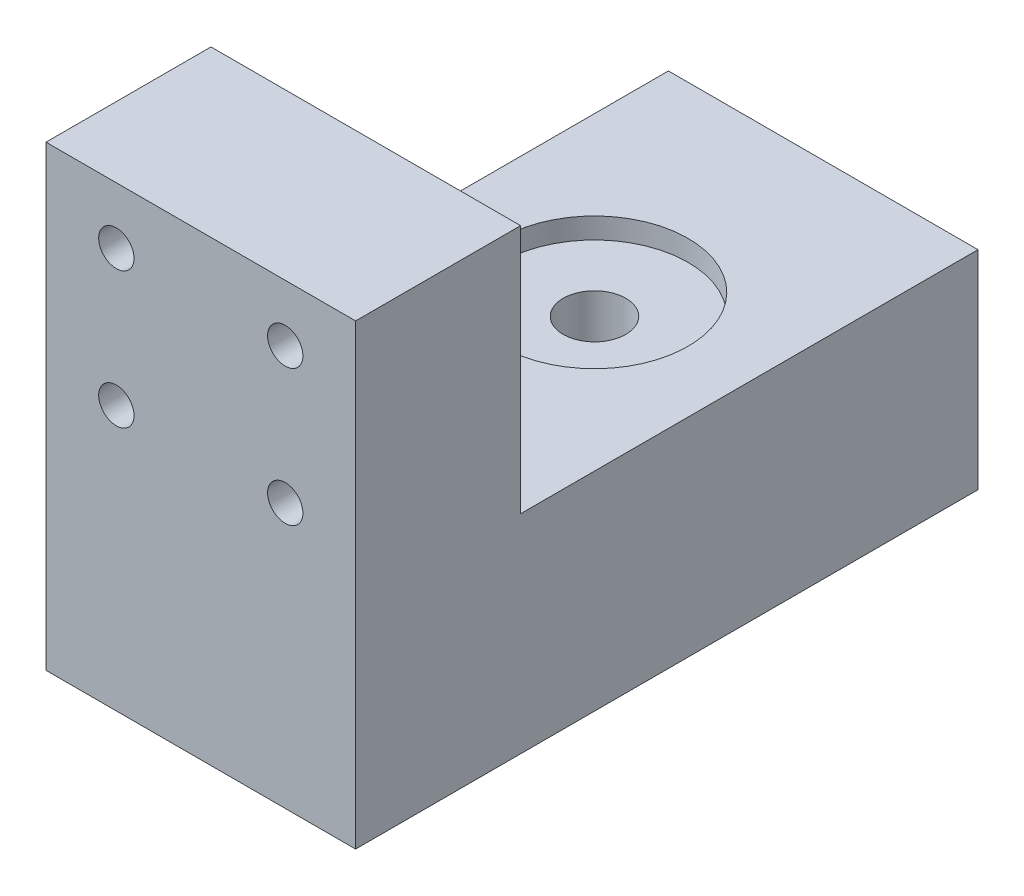
ISO-10303-21;
HEADER;
FILE_DESCRIPTION(('STEP AP214'),'2;1');
FILE_NAME('part.step','',(''),(''),'','','');
FILE_SCHEMA(('AUTOMOTIVE_DESIGN { 1 0 10303 214 1 1 1 1 }'));
ENDSEC;
DATA;
#1=APPLICATION_CONTEXT('core data for automotive mechanical design processes');
#2=APPLICATION_PROTOCOL_DEFINITION('international standard','automotive_design',2000,#1);
#3=PRODUCT_CONTEXT('',#1,'mechanical');
#4=PRODUCT('Part','Part','',(#3));
#5=PRODUCT_RELATED_PRODUCT_CATEGORY('part','',(#4));
#6=PRODUCT_DEFINITION_FORMATION('','',#4);
#7=PRODUCT_DEFINITION_CONTEXT('part definition',#1,'design');
#8=PRODUCT_DEFINITION('design','',#6,#7);
#9=PRODUCT_DEFINITION_SHAPE('','',#8);
#10=(LENGTH_UNIT() NAMED_UNIT(*) SI_UNIT(.MILLI.,.METRE.));
#11=(NAMED_UNIT(*) PLANE_ANGLE_UNIT() SI_UNIT($,.RADIAN.));
#12=(NAMED_UNIT(*) SI_UNIT($,.STERADIAN.) SOLID_ANGLE_UNIT());
#13=UNCERTAINTY_MEASURE_WITH_UNIT(LENGTH_MEASURE(1.E-05),#10,'distance_accuracy_value','');
#14=(GEOMETRIC_REPRESENTATION_CONTEXT(3) GLOBAL_UNCERTAINTY_ASSIGNED_CONTEXT((#13)) GLOBAL_UNIT_ASSIGNED_CONTEXT((#10,
#11,#12)) REPRESENTATION_CONTEXT('',''));
#15=CARTESIAN_POINT('',(0.,0.,0.));
#16=DIRECTION('',(0.,0.,1.));
#17=DIRECTION('',(1.,0.,0.));
#18=AXIS2_PLACEMENT_3D('',#15,#16,#17);
#19=CARTESIAN_POINT('',(14.89,-10.,44.));
#20=DIRECTION('',(-1.,0.,0.));
#21=DIRECTION('',(0.,-1.,0.));
#22=AXIS2_PLACEMENT_3D('',#19,#20,#21);
#23=PLANE('',#22);
#24=DIRECTION('',(0.,1.,0.));
#25=VECTOR('',#24,1.);
#26=CARTESIAN_POINT('',(14.89,-10.,0.));
#27=LINE('',#26,#25);
#28=CARTESIAN_POINT('',(14.89,-10.,0.));
#29=VERTEX_POINT('',#28);
#30=CARTESIAN_POINT('',(14.89,10.,0.));
#31=VERTEX_POINT('',#30);
#32=EDGE_CURVE('E98',#29,#31,#27,.T.);
#33=ORIENTED_EDGE('',*,*,#32,.T.);
#34=DIRECTION('',(0.,0.,-1.));
#35=VECTOR('',#34,1.);
#36=CARTESIAN_POINT('',(14.89,10.,44.));
#37=LINE('',#36,#35);
#38=CARTESIAN_POINT('',(14.89,10.,44.));
#39=VERTEX_POINT('',#38);
#40=EDGE_CURVE('E11',#39,#31,#37,.T.);
#41=ORIENTED_EDGE('',*,*,#40,.F.);
#42=DIRECTION('',(0.,1.,0.));
#43=VECTOR('',#42,1.);
#44=CARTESIAN_POINT('',(14.89,-10.,44.));
#45=LINE('',#44,#43);
#46=CARTESIAN_POINT('',(14.89,34.,44.));
#47=VERTEX_POINT('',#46);
#48=EDGE_CURVE('E133',#39,#47,#45,.T.);
#49=ORIENTED_EDGE('',*,*,#48,.T.);
#50=DIRECTION('',(0.,0.,-1.));
#51=VECTOR('',#50,1.);
#52=CARTESIAN_POINT('',(14.89,34.,59.87));
#53=LINE('',#52,#51);
#54=CARTESIAN_POINT('',(14.89,34.,59.87));
#55=VERTEX_POINT('',#54);
#56=EDGE_CURVE('E116',#55,#47,#53,.T.);
#57=ORIENTED_EDGE('',*,*,#56,.F.);
#58=DIRECTION('',(0.,1.,0.));
#59=VECTOR('',#58,1.);
#60=CARTESIAN_POINT('',(14.89,-10.,59.87));
#61=LINE('',#60,#59);
#62=CARTESIAN_POINT('',(14.89,-10.,59.87));
#63=VERTEX_POINT('',#62);
#64=EDGE_CURVE('E107',#63,#55,#61,.T.);
#65=ORIENTED_EDGE('',*,*,#64,.F.);
#66=DIRECTION('',(0.,0.,-1.));
#67=VECTOR('',#66,1.);
#68=CARTESIAN_POINT('',(14.89,-10.,44.));
#69=LINE('',#68,#67);
#70=EDGE_CURVE('E82',#63,#29,#69,.T.);
#71=ORIENTED_EDGE('',*,*,#70,.T.);
#72=EDGE_LOOP('',(#33,#41,#49,#57,#65,#71));
#73=FACE_BOUND('',#72,.T.);
#74=ADVANCED_FACE('F41',(#73),#23,.F.);
#75=CARTESIAN_POINT('',(14.89,10.,44.));
#76=DIRECTION('',(0.,-1.,0.));
#77=DIRECTION('',(1.,0.,0.));
#78=AXIS2_PLACEMENT_3D('',#75,#76,#77);
#79=PLANE('',#78);
#80=CARTESIAN_POINT('',(0.,10.,22.));
#81=DIRECTION('',(0.,1.,0.));
#82=DIRECTION('',(-1.,0.,0.));
#83=AXIS2_PLACEMENT_3D('',#80,#81,#82);
#84=CIRCLE('',#83,9.);
#85=CARTESIAN_POINT('',(-9.,10.,22.));
#86=VERTEX_POINT('',#85);
#87=EDGE_CURVE('E152',#86,#86,#84,.T.);
#88=ORIENTED_EDGE('',*,*,#87,.F.);
#89=EDGE_LOOP('',(#88));
#90=FACE_BOUND('',#89,.T.);
#91=DIRECTION('',(-1.,0.,0.));
#92=VECTOR('',#91,1.);
#93=CARTESIAN_POINT('',(14.89,10.,0.));
#94=LINE('',#93,#92);
#95=CARTESIAN_POINT('',(-14.89,10.,0.));
#96=VERTEX_POINT('',#95);
#97=EDGE_CURVE('E91',#31,#96,#94,.T.);
#98=ORIENTED_EDGE('',*,*,#97,.T.);
#99=DIRECTION('',(0.,0.,-1.));
#100=VECTOR('',#99,1.);
#101=CARTESIAN_POINT('',(-14.89,10.,44.));
#102=LINE('',#101,#100);
#103=CARTESIAN_POINT('',(-14.89,10.,44.));
#104=VERTEX_POINT('',#103);
#105=EDGE_CURVE('E47',#104,#96,#102,.T.);
#106=ORIENTED_EDGE('',*,*,#105,.F.);
#107=DIRECTION('',(-1.,0.,0.));
#108=VECTOR('',#107,1.);
#109=CARTESIAN_POINT('',(14.89,10.,44.));
#110=LINE('',#109,#108);
#111=EDGE_CURVE('E54',#39,#104,#110,.T.);
#112=ORIENTED_EDGE('',*,*,#111,.F.);
#113=ORIENTED_EDGE('',*,*,#40,.T.);
#114=EDGE_LOOP('',(#98,#106,#112,#113));
#115=FACE_BOUND('',#114,.T.);
#116=ADVANCED_FACE('F138',(#90,#115),#79,.F.);
#117=CARTESIAN_POINT('',(-14.89,-10.,44.));
#118=DIRECTION('',(-1.,0.,0.));
#119=DIRECTION('',(0.,0.,1.));
#120=AXIS2_PLACEMENT_3D('',#117,#118,#119);
#121=PLANE('',#120);
#122=DIRECTION('',(0.,1.,0.));
#123=VECTOR('',#122,1.);
#124=CARTESIAN_POINT('',(-14.89,-10.,0.));
#125=LINE('',#124,#123);
#126=CARTESIAN_POINT('',(-14.89,-10.,0.));
#127=VERTEX_POINT('',#126);
#128=EDGE_CURVE('E86',#127,#96,#125,.T.);
#129=ORIENTED_EDGE('',*,*,#128,.F.);
#130=DIRECTION('',(0.,0.,-1.));
#131=VECTOR('',#130,1.);
#132=CARTESIAN_POINT('',(-14.89,-10.,44.));
#133=LINE('',#132,#131);
#134=CARTESIAN_POINT('',(-14.89,-10.,59.87));
#135=VERTEX_POINT('',#134);
#136=EDGE_CURVE('E71',#135,#127,#133,.T.);
#137=ORIENTED_EDGE('',*,*,#136,.F.);
#138=DIRECTION('',(0.,1.,0.));
#139=VECTOR('',#138,1.);
#140=CARTESIAN_POINT('',(-14.89,-10.,59.87));
#141=LINE('',#140,#139);
#142=CARTESIAN_POINT('',(-14.89,34.,59.87));
#143=VERTEX_POINT('',#142);
#144=EDGE_CURVE('E111',#135,#143,#141,.T.);
#145=ORIENTED_EDGE('',*,*,#144,.T.);
#146=DIRECTION('',(0.,0.,-1.));
#147=VECTOR('',#146,1.);
#148=CARTESIAN_POINT('',(-14.89,34.,59.87));
#149=LINE('',#148,#147);
#150=CARTESIAN_POINT('',(-14.89,34.,44.));
#151=VERTEX_POINT('',#150);
#152=EDGE_CURVE('E113',#143,#151,#149,.T.);
#153=ORIENTED_EDGE('',*,*,#152,.T.);
#154=DIRECTION('',(0.,1.,0.));
#155=VECTOR('',#154,1.);
#156=CARTESIAN_POINT('',(-14.89,-10.,44.));
#157=LINE('',#156,#155);
#158=EDGE_CURVE('E124',#104,#151,#157,.T.);
#159=ORIENTED_EDGE('',*,*,#158,.F.);
#160=ORIENTED_EDGE('',*,*,#105,.T.);
#161=EDGE_LOOP('',(#129,#137,#145,#153,#159,#160));
#162=FACE_BOUND('',#161,.T.);
#163=ADVANCED_FACE('F90',(#162),#121,.T.);
#164=CARTESIAN_POINT('',(14.89,-10.,44.));
#165=DIRECTION('',(0.,-1.,0.));
#166=DIRECTION('',(1.,0.,0.));
#167=AXIS2_PLACEMENT_3D('',#164,#165,#166);
#168=PLANE('',#167);
#169=CARTESIAN_POINT('',(0.,-10.,22.));
#170=DIRECTION('',(0.,1.,0.));
#171=DIRECTION('',(-1.,0.,0.));
#172=AXIS2_PLACEMENT_3D('',#169,#170,#171);
#173=CIRCLE('',#172,3.0125);
#174=CARTESIAN_POINT('',(-3.0125,-10.,22.));
#175=VERTEX_POINT('',#174);
#176=EDGE_CURVE('E160',#175,#175,#173,.T.);
#177=ORIENTED_EDGE('',*,*,#176,.T.);
#178=EDGE_LOOP('',(#177));
#179=FACE_BOUND('',#178,.T.);
#180=DIRECTION('',(-1.,0.,0.));
#181=VECTOR('',#180,1.);
#182=CARTESIAN_POINT('',(14.89,-10.,0.));
#183=LINE('',#182,#181);
#184=EDGE_CURVE('E76',#29,#127,#183,.T.);
#185=ORIENTED_EDGE('',*,*,#184,.F.);
#186=ORIENTED_EDGE('',*,*,#70,.F.);
#187=DIRECTION('',(1.,0.,0.));
#188=VECTOR('',#187,1.);
#189=CARTESIAN_POINT('',(-14.89,-10.,59.87));
#190=LINE('',#189,#188);
#191=EDGE_CURVE('E83',#135,#63,#190,.T.);
#192=ORIENTED_EDGE('',*,*,#191,.F.);
#193=ORIENTED_EDGE('',*,*,#136,.T.);
#194=EDGE_LOOP('',(#185,#186,#192,#193));
#195=FACE_BOUND('',#194,.T.);
#196=ADVANCED_FACE('F73',(#179,#195),#168,.T.);
#197=CARTESIAN_POINT('',(0.,0.,0.));
#198=DIRECTION('',(0.,0.,1.));
#199=DIRECTION('',(1.,0.,0.));
#200=AXIS2_PLACEMENT_3D('',#197,#198,#199);
#201=PLANE('',#200);
#202=ORIENTED_EDGE('',*,*,#32,.F.);
#203=ORIENTED_EDGE('',*,*,#184,.T.);
#204=ORIENTED_EDGE('',*,*,#128,.T.);
#205=ORIENTED_EDGE('',*,*,#97,.F.);
#206=EDGE_LOOP('',(#202,#203,#204,#205));
#207=FACE_BOUND('',#206,.T.);
#208=ADVANCED_FACE('F96',(#207),#201,.F.);
#209=CARTESIAN_POINT('',(-14.89,34.,59.87));
#210=DIRECTION('',(0.,1.,0.));
#211=DIRECTION('',(0.,0.,1.));
#212=AXIS2_PLACEMENT_3D('',#209,#210,#211);
#213=PLANE('',#212);
#214=DIRECTION('',(1.,0.,0.));
#215=VECTOR('',#214,1.);
#216=CARTESIAN_POINT('',(-14.89,34.,44.));
#217=LINE('',#216,#215);
#218=EDGE_CURVE('E130',#151,#47,#217,.T.);
#219=ORIENTED_EDGE('',*,*,#218,.F.);
#220=ORIENTED_EDGE('',*,*,#152,.F.);
#221=DIRECTION('',(1.,0.,0.));
#222=VECTOR('',#221,1.);
#223=CARTESIAN_POINT('',(-14.89,34.,59.87));
#224=LINE('',#223,#222);
#225=EDGE_CURVE('E117',#143,#55,#224,.T.);
#226=ORIENTED_EDGE('',*,*,#225,.T.);
#227=ORIENTED_EDGE('',*,*,#56,.T.);
#228=EDGE_LOOP('',(#219,#220,#226,#227));
#229=FACE_BOUND('',#228,.T.);
#230=ADVANCED_FACE('F148',(#229),#213,.T.);
#231=CARTESIAN_POINT('',(0.,0.,59.87));
#232=DIRECTION('',(0.,0.,-1.));
#233=DIRECTION('',(-1.,0.,0.));
#234=AXIS2_PLACEMENT_3D('',#231,#232,#233);
#235=PLANE('',#234);
#236=CARTESIAN_POINT('',(-8.12371382112812,28.5469822601436,59.87));
#237=DIRECTION('',(0.,0.,-1.));
#238=DIRECTION('',(-1.,0.,0.));
#239=AXIS2_PLACEMENT_3D('',#236,#237,#238);
#240=CIRCLE('',#239,1.7);
#241=CARTESIAN_POINT('',(-9.82371382112813,28.5469822601436,59.87));
#242=VERTEX_POINT('',#241);
#243=EDGE_CURVE('E175',#242,#242,#240,.T.);
#244=ORIENTED_EDGE('',*,*,#243,.T.);
#245=EDGE_LOOP('',(#244));
#246=FACE_BOUND('',#245,.T.);
#247=CARTESIAN_POINT('',(-8.12371382112812,15.4530177398565,59.87));
#248=DIRECTION('',(0.,0.,-1.));
#249=DIRECTION('',(-1.,0.,0.));
#250=AXIS2_PLACEMENT_3D('',#247,#248,#249);
#251=CIRCLE('',#250,1.7);
#252=CARTESIAN_POINT('',(-9.82371382112812,15.4530177398565,59.87));
#253=VERTEX_POINT('',#252);
#254=EDGE_CURVE('E176',#253,#253,#251,.T.);
#255=ORIENTED_EDGE('',*,*,#254,.T.);
#256=EDGE_LOOP('',(#255));
#257=FACE_BOUND('',#256,.T.);
#258=CARTESIAN_POINT('',(8.12371382112813,15.4530177398565,59.87));
#259=DIRECTION('',(0.,0.,-1.));
#260=DIRECTION('',(-1.,0.,0.));
#261=AXIS2_PLACEMENT_3D('',#258,#259,#260);
#262=CIRCLE('',#261,1.7);
#263=CARTESIAN_POINT('',(6.42371382112813,15.4530177398565,59.87));
#264=VERTEX_POINT('',#263);
#265=EDGE_CURVE('E184',#264,#264,#262,.T.);
#266=ORIENTED_EDGE('',*,*,#265,.T.);
#267=EDGE_LOOP('',(#266));
#268=FACE_BOUND('',#267,.T.);
#269=CARTESIAN_POINT('',(8.12371382112813,28.5469822601436,59.87));
#270=DIRECTION('',(0.,0.,-1.));
#271=DIRECTION('',(-1.,0.,0.));
#272=AXIS2_PLACEMENT_3D('',#269,#270,#271);
#273=CIRCLE('',#272,1.7);
#274=CARTESIAN_POINT('',(6.42371382112813,28.5469822601436,59.87));
#275=VERTEX_POINT('',#274);
#276=EDGE_CURVE('E162',#275,#275,#273,.T.);
#277=ORIENTED_EDGE('',*,*,#276,.T.);
#278=EDGE_LOOP('',(#277));
#279=FACE_BOUND('',#278,.T.);
#280=ORIENTED_EDGE('',*,*,#144,.F.);
#281=ORIENTED_EDGE('',*,*,#191,.T.);
#282=ORIENTED_EDGE('',*,*,#64,.T.);
#283=ORIENTED_EDGE('',*,*,#225,.F.);
#284=EDGE_LOOP('',(#280,#281,#282,#283));
#285=FACE_BOUND('',#284,.T.);
#286=ADVANCED_FACE('F115',(#246,#257,#268,#279,#285),#235,.F.);
#287=CARTESIAN_POINT('',(0.,0.,44.));
#288=DIRECTION('',(0.,0.,-1.));
#289=DIRECTION('',(-1.,0.,0.));
#290=AXIS2_PLACEMENT_3D('',#287,#288,#289);
#291=PLANE('',#290);
#292=CARTESIAN_POINT('',(-8.12371382112812,28.5469822601436,44.));
#293=DIRECTION('',(0.,0.,-1.));
#294=DIRECTION('',(-1.,0.,0.));
#295=AXIS2_PLACEMENT_3D('',#292,#293,#294);
#296=CIRCLE('',#295,1.7);
#297=CARTESIAN_POINT('',(-9.82371382112813,28.5469822601436,44.));
#298=VERTEX_POINT('',#297);
#299=EDGE_CURVE('E172',#298,#298,#296,.T.);
#300=ORIENTED_EDGE('',*,*,#299,.F.);
#301=EDGE_LOOP('',(#300));
#302=FACE_BOUND('',#301,.T.);
#303=CARTESIAN_POINT('',(-8.12371382112812,15.4530177398565,44.));
#304=DIRECTION('',(0.,0.,-1.));
#305=DIRECTION('',(-1.,0.,0.));
#306=AXIS2_PLACEMENT_3D('',#303,#304,#305);
#307=CIRCLE('',#306,1.7);
#308=CARTESIAN_POINT('',(-9.82371382112812,15.4530177398565,44.));
#309=VERTEX_POINT('',#308);
#310=EDGE_CURVE('E182',#309,#309,#307,.T.);
#311=ORIENTED_EDGE('',*,*,#310,.F.);
#312=EDGE_LOOP('',(#311));
#313=FACE_BOUND('',#312,.T.);
#314=CARTESIAN_POINT('',(8.12371382112813,15.4530177398565,44.));
#315=DIRECTION('',(0.,0.,-1.));
#316=DIRECTION('',(-1.,0.,0.));
#317=AXIS2_PLACEMENT_3D('',#314,#315,#316);
#318=CIRCLE('',#317,1.7);
#319=CARTESIAN_POINT('',(6.42371382112813,15.4530177398565,44.));
#320=VERTEX_POINT('',#319);
#321=EDGE_CURVE('E166',#320,#320,#318,.T.);
#322=ORIENTED_EDGE('',*,*,#321,.F.);
#323=EDGE_LOOP('',(#322));
#324=FACE_BOUND('',#323,.T.);
#325=CARTESIAN_POINT('',(8.12371382112813,28.5469822601436,44.));
#326=DIRECTION('',(0.,0.,-1.));
#327=DIRECTION('',(-1.,0.,0.));
#328=AXIS2_PLACEMENT_3D('',#325,#326,#327);
#329=CIRCLE('',#328,1.7);
#330=CARTESIAN_POINT('',(6.42371382112813,28.5469822601436,44.));
#331=VERTEX_POINT('',#330);
#332=EDGE_CURVE('E167',#331,#331,#329,.T.);
#333=ORIENTED_EDGE('',*,*,#332,.F.);
#334=EDGE_LOOP('',(#333));
#335=FACE_BOUND('',#334,.T.);
#336=ORIENTED_EDGE('',*,*,#48,.F.);
#337=ORIENTED_EDGE('',*,*,#111,.T.);
#338=ORIENTED_EDGE('',*,*,#158,.T.);
#339=ORIENTED_EDGE('',*,*,#218,.T.);
#340=EDGE_LOOP('',(#336,#337,#338,#339));
#341=FACE_BOUND('',#340,.T.);
#342=ADVANCED_FACE('F137',(#302,#313,#324,#335,#341),#291,.T.);
#343=CARTESIAN_POINT('',(0.,8.,22.));
#344=DIRECTION('',(0.,1.,0.));
#345=DIRECTION('',(-1.,0.,0.));
#346=AXIS2_PLACEMENT_3D('',#343,#344,#345);
#347=CYLINDRICAL_SURFACE('',#346,9.);
#348=CARTESIAN_POINT('',(0.,8.,22.));
#349=DIRECTION('',(0.,1.,0.));
#350=DIRECTION('',(-1.,0.,0.));
#351=AXIS2_PLACEMENT_3D('',#348,#349,#350);
#352=CIRCLE('',#351,9.);
#353=CARTESIAN_POINT('',(-9.,8.,22.));
#354=VERTEX_POINT('',#353);
#355=EDGE_CURVE('E126',#354,#354,#352,.T.);
#356=ORIENTED_EDGE('',*,*,#355,.F.);
#357=EDGE_LOOP('',(#356));
#358=FACE_BOUND('',#357,.T.);
#359=ORIENTED_EDGE('',*,*,#87,.T.);
#360=EDGE_LOOP('',(#359));
#361=FACE_BOUND('',#360,.T.);
#362=ADVANCED_FACE('F194',(#358,#361),#347,.F.);
#363=CARTESIAN_POINT('',(0.,8.,22.));
#364=DIRECTION('',(0.,1.,0.));
#365=DIRECTION('',(-1.,0.,0.));
#366=AXIS2_PLACEMENT_3D('',#363,#364,#365);
#367=PLANE('',#366);
#368=CARTESIAN_POINT('',(0.,8.,22.));
#369=DIRECTION('',(0.,1.,0.));
#370=DIRECTION('',(-1.,0.,0.));
#371=AXIS2_PLACEMENT_3D('',#368,#369,#370);
#372=CIRCLE('',#371,3.0125);
#373=CARTESIAN_POINT('',(-3.0125,8.,22.));
#374=VERTEX_POINT('',#373);
#375=EDGE_CURVE('E159',#374,#374,#372,.T.);
#376=ORIENTED_EDGE('',*,*,#375,.F.);
#377=EDGE_LOOP('',(#376));
#378=FACE_BOUND('',#377,.T.);
#379=ORIENTED_EDGE('',*,*,#355,.T.);
#380=EDGE_LOOP('',(#379));
#381=FACE_BOUND('',#380,.T.);
#382=ADVANCED_FACE('F211',(#378,#381),#367,.T.);
#383=CARTESIAN_POINT('',(0.,-10.,22.));
#384=DIRECTION('',(0.,1.,0.));
#385=DIRECTION('',(-1.,0.,0.));
#386=AXIS2_PLACEMENT_3D('',#383,#384,#385);
#387=CYLINDRICAL_SURFACE('',#386,3.0125);
#388=ORIENTED_EDGE('',*,*,#176,.F.);
#389=EDGE_LOOP('',(#388));
#390=FACE_BOUND('',#389,.T.);
#391=ORIENTED_EDGE('',*,*,#375,.T.);
#392=EDGE_LOOP('',(#391));
#393=FACE_BOUND('',#392,.T.);
#394=ADVANCED_FACE('F203',(#390,#393),#387,.F.);
#395=CARTESIAN_POINT('',(8.12371382112813,28.5469822601436,59.87));
#396=DIRECTION('',(0.,0.,-1.));
#397=DIRECTION('',(-1.,0.,0.));
#398=AXIS2_PLACEMENT_3D('',#395,#396,#397);
#399=CYLINDRICAL_SURFACE('',#398,1.7);
#400=ORIENTED_EDGE('',*,*,#276,.F.);
#401=EDGE_LOOP('',(#400));
#402=FACE_BOUND('',#401,.T.);
#403=ORIENTED_EDGE('',*,*,#332,.T.);
#404=EDGE_LOOP('',(#403));
#405=FACE_BOUND('',#404,.T.);
#406=ADVANCED_FACE('F200',(#402,#405),#399,.F.);
#407=CARTESIAN_POINT('',(8.12371382112813,15.4530177398565,59.87));
#408=DIRECTION('',(0.,0.,-1.));
#409=DIRECTION('',(-1.,0.,0.));
#410=AXIS2_PLACEMENT_3D('',#407,#408,#409);
#411=CYLINDRICAL_SURFACE('',#410,1.7);
#412=ORIENTED_EDGE('',*,*,#265,.F.);
#413=EDGE_LOOP('',(#412));
#414=FACE_BOUND('',#413,.T.);
#415=ORIENTED_EDGE('',*,*,#321,.T.);
#416=EDGE_LOOP('',(#415));
#417=FACE_BOUND('',#416,.T.);
#418=ADVANCED_FACE('F187',(#414,#417),#411,.F.);
#419=CARTESIAN_POINT('',(-8.12371382112812,15.4530177398565,59.87));
#420=DIRECTION('',(0.,0.,-1.));
#421=DIRECTION('',(-1.,0.,0.));
#422=AXIS2_PLACEMENT_3D('',#419,#420,#421);
#423=CYLINDRICAL_SURFACE('',#422,1.7);
#424=ORIENTED_EDGE('',*,*,#254,.F.);
#425=EDGE_LOOP('',(#424));
#426=FACE_BOUND('',#425,.T.);
#427=ORIENTED_EDGE('',*,*,#310,.T.);
#428=EDGE_LOOP('',(#427));
#429=FACE_BOUND('',#428,.T.);
#430=ADVANCED_FACE('F210',(#426,#429),#423,.F.);
#431=CARTESIAN_POINT('',(-8.12371382112812,28.5469822601436,59.87));
#432=DIRECTION('',(0.,0.,-1.));
#433=DIRECTION('',(-1.,0.,0.));
#434=AXIS2_PLACEMENT_3D('',#431,#432,#433);
#435=CYLINDRICAL_SURFACE('',#434,1.7);
#436=ORIENTED_EDGE('',*,*,#243,.F.);
#437=EDGE_LOOP('',(#436));
#438=FACE_BOUND('',#437,.T.);
#439=ORIENTED_EDGE('',*,*,#299,.T.);
#440=EDGE_LOOP('',(#439));
#441=FACE_BOUND('',#440,.T.);
#442=ADVANCED_FACE('F291',(#438,#441),#435,.F.);
#443=CLOSED_SHELL('',(#74,#116,#163,#196,#208,#230,#286,#342,#362,#382,#394,#406,#418,#430,#442));
#444=MANIFOLD_SOLID_BREP('B2',#443);
#445=ADVANCED_BREP_SHAPE_REPRESENTATION('',(#18,#444),#14);
#446=SHAPE_DEFINITION_REPRESENTATION(#9,#445);
ENDSEC;
END-ISO-10303-21;
